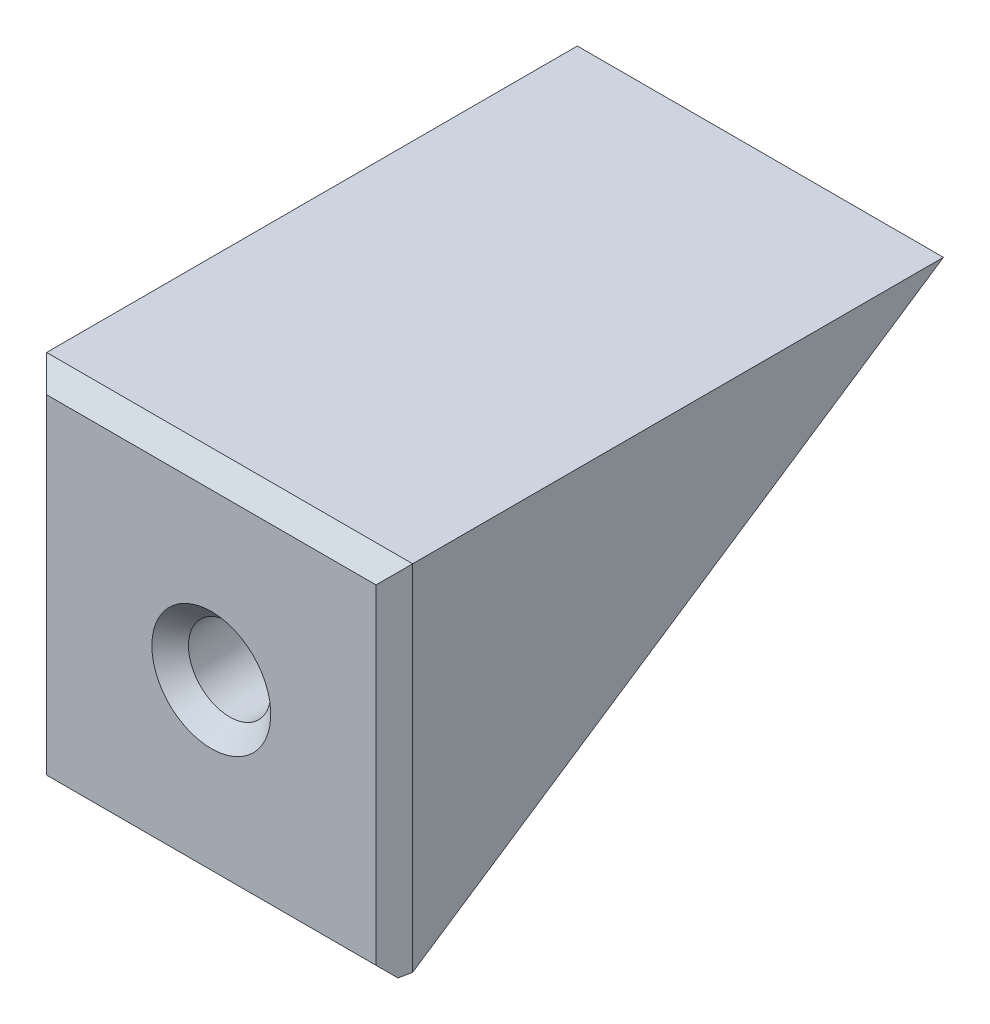
ISO-10303-21;
HEADER;
FILE_DESCRIPTION(('STEP AP214'),'2;1');
FILE_NAME('part.step','',(''),(''),'','','');
FILE_SCHEMA(('AUTOMOTIVE_DESIGN { 1 0 10303 214 1 1 1 1 }'));
ENDSEC;
DATA;
#1=APPLICATION_CONTEXT('core data for automotive mechanical design processes');
#2=APPLICATION_PROTOCOL_DEFINITION('international standard','automotive_design',2000,#1);
#3=PRODUCT_CONTEXT('',#1,'mechanical');
#4=PRODUCT('Part','Part','',(#3));
#5=PRODUCT_RELATED_PRODUCT_CATEGORY('part','',(#4));
#6=PRODUCT_DEFINITION_FORMATION('','',#4);
#7=PRODUCT_DEFINITION_CONTEXT('part definition',#1,'design');
#8=PRODUCT_DEFINITION('design','',#6,#7);
#9=PRODUCT_DEFINITION_SHAPE('','',#8);
#10=(LENGTH_UNIT() NAMED_UNIT(*) SI_UNIT(.MILLI.,.METRE.));
#11=(NAMED_UNIT(*) PLANE_ANGLE_UNIT() SI_UNIT($,.RADIAN.));
#12=(NAMED_UNIT(*) SI_UNIT($,.STERADIAN.) SOLID_ANGLE_UNIT());
#13=UNCERTAINTY_MEASURE_WITH_UNIT(LENGTH_MEASURE(1.E-05),#10,'distance_accuracy_value','');
#14=(GEOMETRIC_REPRESENTATION_CONTEXT(3) GLOBAL_UNCERTAINTY_ASSIGNED_CONTEXT((#13)) GLOBAL_UNIT_ASSIGNED_CONTEXT((#10,
#11,#12)) REPRESENTATION_CONTEXT('',''));
#15=CARTESIAN_POINT('',(0.,0.,0.));
#16=DIRECTION('',(0.,0.,1.));
#17=DIRECTION('',(1.,0.,0.));
#18=AXIS2_PLACEMENT_3D('',#15,#16,#17);
#19=CARTESIAN_POINT('',(0.,-10.,-17.));
#20=DIRECTION('',(0.,0.,1.));
#21=DIRECTION('',(1.,0.,0.));
#22=AXIS2_PLACEMENT_3D('',#19,#20,#21);
#23=PLANE('',#22);
#24=CARTESIAN_POINT('',(0.,-10.,-17.));
#25=DIRECTION('',(0.,0.,1.));
#26=DIRECTION('',(1.,0.,0.));
#27=AXIS2_PLACEMENT_3D('',#24,#25,#26);
#28=CIRCLE('',#27,5.5);
#29=CARTESIAN_POINT('',(-5.33593686452737,-8.66666666666667,-17.));
#30=VERTEX_POINT('',#29);
#31=CARTESIAN_POINT('',(5.33593686452737,-8.66666666666667,-17.));
#32=VERTEX_POINT('',#31);
#33=EDGE_CURVE('E116',#30,#32,#28,.T.);
#34=ORIENTED_EDGE('',*,*,#33,.F.);
#35=CARTESIAN_POINT('',(0.,-10.,-17.));
#36=DIRECTION('',(0.,0.,-1.));
#37=DIRECTION('',(-1.,0.,0.));
#38=AXIS2_PLACEMENT_3D('',#35,#36,#37);
#39=CIRCLE('',#38,5.5);
#40=EDGE_CURVE('E102',#30,#32,#39,.T.);
#41=ORIENTED_EDGE('',*,*,#40,.T.);
#42=EDGE_LOOP('',(#34,#41));
#43=FACE_BOUND('',#42,.T.);
#44=CARTESIAN_POINT('',(0.,-10.,-17.));
#45=DIRECTION('',(0.,0.,-1.));
#46=DIRECTION('',(-1.,0.,0.));
#47=AXIS2_PLACEMENT_3D('',#44,#45,#46);
#48=CIRCLE('',#47,4.2164);
#49=CARTESIAN_POINT('',(-4.2164,-10.,-17.));
#50=VERTEX_POINT('',#49);
#51=EDGE_CURVE('E167',#50,#50,#48,.T.);
#52=ORIENTED_EDGE('',*,*,#51,.F.);
#53=EDGE_LOOP('',(#52));
#54=FACE_BOUND('',#53,.T.);
#55=ADVANCED_FACE('F39',(#43,#54),#23,.F.);
#56=CARTESIAN_POINT('',(10.,0.,-30.));
#57=DIRECTION('',(0.,0.832050294337844,0.554700196225229));
#58=DIRECTION('',(0.,-0.554700196225229,0.832050294337844));
#59=AXIS2_PLACEMENT_3D('',#56,#57,#58);
#60=PLANE('',#59);
#61=DIRECTION('',(0.,0.554700196225229,-0.832050294337844));
#62=VECTOR('',#61,1.);
#63=CARTESIAN_POINT('',(10.,0.,-30.));
#64=LINE('',#63,#62);
#65=CARTESIAN_POINT('',(10.,-19.3333333333333,-0.999999999999997));
#66=VERTEX_POINT('',#65);
#67=CARTESIAN_POINT('',(10.,0.,-30.));
#68=VERTEX_POINT('',#67);
#69=EDGE_CURVE('E129',#66,#68,#64,.T.);
#70=ORIENTED_EDGE('',*,*,#69,.F.);
#71=DIRECTION('',(0.63960214906683,0.426401432711222,-0.639602149066832));
#72=VECTOR('',#71,1.);
#73=CARTESIAN_POINT('',(15.2727272727273,-15.8181818181818,-6.27272727272729));
#74=LINE('',#73,#72);
#75=CARTESIAN_POINT('',(9.6,-19.6,-0.6));
#76=VERTEX_POINT('',#75);
#77=EDGE_CURVE('E140',#66,#76,#74,.F.);
#78=ORIENTED_EDGE('',*,*,#77,.T.);
#79=DIRECTION('',(-1.,0.,0.));
#80=VECTOR('',#79,1.);
#81=CARTESIAN_POINT('',(10.,-19.6,-0.6));
#82=LINE('',#81,#80);
#83=CARTESIAN_POINT('',(-9.6,-19.6,-0.6));
#84=VERTEX_POINT('',#83);
#85=EDGE_CURVE('E137',#76,#84,#82,.T.);
#86=ORIENTED_EDGE('',*,*,#85,.T.);
#87=DIRECTION('',(-0.63960214906683,0.426401432711222,-0.639602149066832));
#88=VECTOR('',#87,1.);
#89=CARTESIAN_POINT('',(-9.,-20.,0.));
#90=LINE('',#89,#88);
#91=CARTESIAN_POINT('',(-10.,-19.3333333333333,-0.999999999999997));
#92=VERTEX_POINT('',#91);
#93=EDGE_CURVE('E120',#84,#92,#90,.T.);
#94=ORIENTED_EDGE('',*,*,#93,.T.);
#95=DIRECTION('',(0.,0.554700196225229,-0.832050294337844));
#96=VECTOR('',#95,1.);
#97=CARTESIAN_POINT('',(-10.,0.,-30.));
#98=LINE('',#97,#96);
#99=CARTESIAN_POINT('',(-10.,0.,-30.));
#100=VERTEX_POINT('',#99);
#101=EDGE_CURVE('E124',#92,#100,#98,.T.);
#102=ORIENTED_EDGE('',*,*,#101,.T.);
#103=DIRECTION('',(-1.,0.,0.));
#104=VECTOR('',#103,1.);
#105=CARTESIAN_POINT('',(10.,0.,-30.));
#106=LINE('',#105,#104);
#107=EDGE_CURVE('E121',#68,#100,#106,.T.);
#108=ORIENTED_EDGE('',*,*,#107,.F.);
#109=EDGE_LOOP('',(#70,#78,#86,#94,#102,#108));
#110=FACE_BOUND('',#109,.T.);
#111=CARTESIAN_POINT('',(0.,-10.,-15.));
#112=DIRECTION('',(0.,0.832050294337844,0.554700196225229));
#113=DIRECTION('',(0.,-0.554700196225229,0.832050294337844));
#114=AXIS2_PLACEMENT_3D('',#111,#112,#113);
#115=ELLIPSE('',#114,9.91526600752597,5.5);
#116=EDGE_CURVE('E105',#30,#32,#115,.F.);
#117=ORIENTED_EDGE('',*,*,#116,.F.);
#118=CARTESIAN_POINT('',(0.,-10.,-15.));
#119=DIRECTION('',(0.,0.832050294337844,0.554700196225229));
#120=DIRECTION('',(0.,0.554700196225229,-0.832050294337844));
#121=AXIS2_PLACEMENT_3D('',#118,#119,#120);
#122=ELLIPSE('',#121,9.91526600752597,5.5);
#123=EDGE_CURVE('E114',#32,#30,#122,.F.);
#124=ORIENTED_EDGE('',*,*,#123,.F.);
#125=EDGE_LOOP('',(#117,#124));
#126=FACE_BOUND('',#125,.T.);
#127=ADVANCED_FACE('F113',(#110,#126),#60,.F.);
#128=CARTESIAN_POINT('',(10.,-20.,0.));
#129=DIRECTION('',(0.,0.,-1.));
#130=DIRECTION('',(-1.,0.,0.));
#131=AXIS2_PLACEMENT_3D('',#128,#129,#130);
#132=PLANE('',#131);
#133=DIRECTION('',(0.,-1.,0.));
#134=VECTOR('',#133,1.);
#135=CARTESIAN_POINT('',(-9.,-20.,0.));
#136=LINE('',#135,#134);
#137=CARTESIAN_POINT('',(-9.,-1.,0.));
#138=VERTEX_POINT('',#137);
#139=CARTESIAN_POINT('',(-9.,-19.,0.));
#140=VERTEX_POINT('',#139);
#141=EDGE_CURVE('E145',#138,#140,#136,.T.);
#142=ORIENTED_EDGE('',*,*,#141,.T.);
#143=DIRECTION('',(1.,0.,0.));
#144=VECTOR('',#143,1.);
#145=CARTESIAN_POINT('',(10.,-19.,0.));
#146=LINE('',#145,#144);
#147=CARTESIAN_POINT('',(9.,-19.,0.));
#148=VERTEX_POINT('',#147);
#149=EDGE_CURVE('E151',#140,#148,#146,.T.);
#150=ORIENTED_EDGE('',*,*,#149,.T.);
#151=DIRECTION('',(0.,1.,0.));
#152=VECTOR('',#151,1.);
#153=CARTESIAN_POINT('',(9.,-20.,0.));
#154=LINE('',#153,#152);
#155=CARTESIAN_POINT('',(9.,-1.,0.));
#156=VERTEX_POINT('',#155);
#157=EDGE_CURVE('E149',#148,#156,#154,.T.);
#158=ORIENTED_EDGE('',*,*,#157,.T.);
#159=DIRECTION('',(-1.,0.,0.));
#160=VECTOR('',#159,1.);
#161=CARTESIAN_POINT('',(10.,-1.,0.));
#162=LINE('',#161,#160);
#163=EDGE_CURVE('E147',#156,#138,#162,.T.);
#164=ORIENTED_EDGE('',*,*,#163,.T.);
#165=EDGE_LOOP('',(#142,#150,#158,#164));
#166=FACE_BOUND('',#165,.T.);
#167=CARTESIAN_POINT('',(0.,-10.,0.));
#168=DIRECTION('',(0.,0.,-1.));
#169=DIRECTION('',(-1.,0.,0.));
#170=AXIS2_PLACEMENT_3D('',#167,#168,#169);
#171=CIRCLE('',#170,3.2479);
#172=CARTESIAN_POINT('',(-3.2479,-10.,0.));
#173=VERTEX_POINT('',#172);
#174=EDGE_CURVE('E142',#173,#173,#171,.T.);
#175=ORIENTED_EDGE('',*,*,#174,.T.);
#176=EDGE_LOOP('',(#175));
#177=FACE_BOUND('',#176,.T.);
#178=ADVANCED_FACE('F199',(#166,#177),#132,.F.);
#179=CARTESIAN_POINT('',(10.,0.,0.));
#180=DIRECTION('',(0.,-1.,0.));
#181=DIRECTION('',(0.,0.,-1.));
#182=AXIS2_PLACEMENT_3D('',#179,#180,#181);
#183=PLANE('',#182);
#184=DIRECTION('',(0.,0.,1.));
#185=VECTOR('',#184,1.);
#186=CARTESIAN_POINT('',(-10.,0.,0.));
#187=LINE('',#186,#185);
#188=CARTESIAN_POINT('',(-10.,0.,-1.));
#189=VERTEX_POINT('',#188);
#190=EDGE_CURVE('E126',#100,#189,#187,.T.);
#191=ORIENTED_EDGE('',*,*,#190,.T.);
#192=DIRECTION('',(1.,0.,0.));
#193=VECTOR('',#192,1.);
#194=CARTESIAN_POINT('',(10.,0.,-1.));
#195=LINE('',#194,#193);
#196=CARTESIAN_POINT('',(10.,0.,-1.));
#197=VERTEX_POINT('',#196);
#198=EDGE_CURVE('E63',#189,#197,#195,.T.);
#199=ORIENTED_EDGE('',*,*,#198,.T.);
#200=DIRECTION('',(0.,0.,1.));
#201=VECTOR('',#200,1.);
#202=CARTESIAN_POINT('',(10.,0.,0.));
#203=LINE('',#202,#201);
#204=EDGE_CURVE('E131',#68,#197,#203,.T.);
#205=ORIENTED_EDGE('',*,*,#204,.F.);
#206=ORIENTED_EDGE('',*,*,#107,.T.);
#207=EDGE_LOOP('',(#191,#199,#205,#206));
#208=FACE_BOUND('',#207,.T.);
#209=ADVANCED_FACE('F210',(#208),#183,.F.);
#210=CARTESIAN_POINT('',(10.,0.,0.));
#211=DIRECTION('',(-1.,0.,0.));
#212=DIRECTION('',(0.,0.,1.));
#213=AXIS2_PLACEMENT_3D('',#210,#211,#212);
#214=PLANE('',#213);
#215=ORIENTED_EDGE('',*,*,#204,.T.);
#216=DIRECTION('',(0.,-1.,0.));
#217=VECTOR('',#216,1.);
#218=CARTESIAN_POINT('',(10.,0.,-1.));
#219=LINE('',#218,#217);
#220=EDGE_CURVE('E154',#197,#66,#219,.T.);
#221=ORIENTED_EDGE('',*,*,#220,.T.);
#222=ORIENTED_EDGE('',*,*,#69,.T.);
#223=EDGE_LOOP('',(#215,#221,#222));
#224=FACE_BOUND('',#223,.T.);
#225=ADVANCED_FACE('F207',(#224),#214,.F.);
#226=CARTESIAN_POINT('',(-10.,0.,0.));
#227=DIRECTION('',(-1.,0.,0.));
#228=DIRECTION('',(0.,0.,1.));
#229=AXIS2_PLACEMENT_3D('',#226,#227,#228);
#230=PLANE('',#229);
#231=ORIENTED_EDGE('',*,*,#101,.F.);
#232=DIRECTION('',(0.,1.,0.));
#233=VECTOR('',#232,1.);
#234=CARTESIAN_POINT('',(-10.,0.,-1.));
#235=LINE('',#234,#233);
#236=EDGE_CURVE('E49',#92,#189,#235,.T.);
#237=ORIENTED_EDGE('',*,*,#236,.T.);
#238=ORIENTED_EDGE('',*,*,#190,.F.);
#239=EDGE_LOOP('',(#231,#237,#238));
#240=FACE_BOUND('',#239,.T.);
#241=ADVANCED_FACE('F206',(#240),#230,.T.);
#242=CARTESIAN_POINT('',(0.,-10.,0.));
#243=DIRECTION('',(0.,0.,-1.));
#244=DIRECTION('',(-1.,0.,0.));
#245=AXIS2_PLACEMENT_3D('',#242,#243,#244);
#246=CYLINDRICAL_SURFACE('',#245,5.5);
#247=ORIENTED_EDGE('',*,*,#33,.T.);
#248=ORIENTED_EDGE('',*,*,#123,.T.);
#249=EDGE_LOOP('',(#247,#248));
#250=FACE_BOUND('',#249,.T.);
#251=ADVANCED_FACE('F119',(#250),#246,.T.);
#252=CARTESIAN_POINT('',(0.,-10.,-37.));
#253=DIRECTION('',(0.,0.,1.));
#254=DIRECTION('',(1.,0.,0.));
#255=AXIS2_PLACEMENT_3D('',#252,#253,#254);
#256=CYLINDRICAL_SURFACE('',#255,5.5);
#257=ORIENTED_EDGE('',*,*,#116,.T.);
#258=ORIENTED_EDGE('',*,*,#40,.F.);
#259=EDGE_LOOP('',(#257,#258));
#260=FACE_BOUND('',#259,.T.);
#261=ADVANCED_FACE('F104',(#260),#256,.F.);
#262=CARTESIAN_POINT('',(0.,-10.,-17.));
#263=DIRECTION('',(0.,0.,-1.));
#264=DIRECTION('',(-1.,0.,0.));
#265=AXIS2_PLACEMENT_3D('',#262,#263,#264);
#266=CYLINDRICAL_SURFACE('',#265,2.2479);
#267=CARTESIAN_POINT('',(0.,-10.,-1.00000000000001));
#268=DIRECTION('',(0.,0.,-1.));
#269=DIRECTION('',(-1.,0.,0.));
#270=AXIS2_PLACEMENT_3D('',#267,#268,#269);
#271=CIRCLE('',#270,2.2479);
#272=CARTESIAN_POINT('',(-2.2479,-10.,-1.00000000000001));
#273=VERTEX_POINT('',#272);
#274=EDGE_CURVE('E11',#273,#273,#271,.F.);
#275=ORIENTED_EDGE('',*,*,#274,.T.);
#276=EDGE_LOOP('',(#275));
#277=FACE_BOUND('',#276,.T.);
#278=CARTESIAN_POINT('',(0.,-10.,-14.7354997903854));
#279=DIRECTION('',(0.,0.,-1.));
#280=DIRECTION('',(-1.,0.,0.));
#281=AXIS2_PLACEMENT_3D('',#278,#279,#280);
#282=CIRCLE('',#281,2.2479);
#283=CARTESIAN_POINT('',(-2.2479,-10.,-14.7354997903854));
#284=VERTEX_POINT('',#283);
#285=EDGE_CURVE('E109',#284,#284,#282,.T.);
#286=ORIENTED_EDGE('',*,*,#285,.T.);
#287=EDGE_LOOP('',(#286));
#288=FACE_BOUND('',#287,.T.);
#289=ADVANCED_FACE('F180',(#277,#288),#266,.F.);
#290=CARTESIAN_POINT('',(0.,-10.,-17.));
#291=DIRECTION('',(0.,0.,-1.));
#292=DIRECTION('',(-1.,0.,0.));
#293=AXIS2_PLACEMENT_3D('',#290,#291,#292);
#294=CONICAL_SURFACE('',#293,4.2164,0.715584993317675);
#295=ORIENTED_EDGE('',*,*,#285,.F.);
#296=EDGE_LOOP('',(#295));
#297=FACE_BOUND('',#296,.T.);
#298=ORIENTED_EDGE('',*,*,#51,.T.);
#299=EDGE_LOOP('',(#298));
#300=FACE_BOUND('',#299,.T.);
#301=ADVANCED_FACE('F182',(#297,#300),#294,.F.);
#302=CARTESIAN_POINT('',(10.,-1.,0.));
#303=DIRECTION('',(0.,-0.707106781186549,-0.707106781186546));
#304=DIRECTION('',(-1.,0.,0.));
#305=AXIS2_PLACEMENT_3D('',#302,#303,#304);
#306=PLANE('',#305);
#307=DIRECTION('',(0.577350269189625,-0.577350269189625,0.577350269189627));
#308=VECTOR('',#307,1.);
#309=CARTESIAN_POINT('',(-2.66666666666668,-7.33333333333332,6.33333333333334));
#310=LINE('',#309,#308);
#311=EDGE_CURVE('E161',#138,#189,#310,.F.);
#312=ORIENTED_EDGE('',*,*,#311,.F.);
#313=ORIENTED_EDGE('',*,*,#163,.F.);
#314=DIRECTION('',(0.577350269189625,0.577350269189625,-0.577350269189627));
#315=VECTOR('',#314,1.);
#316=CARTESIAN_POINT('',(9.33333333333333,-0.666666666666668,-0.333333333333334));
#317=LINE('',#316,#315);
#318=EDGE_CURVE('E44',#197,#156,#317,.F.);
#319=ORIENTED_EDGE('',*,*,#318,.F.);
#320=ORIENTED_EDGE('',*,*,#198,.F.);
#321=EDGE_LOOP('',(#312,#313,#319,#320));
#322=FACE_BOUND('',#321,.T.);
#323=ADVANCED_FACE('F184',(#322),#306,.F.);
#324=CARTESIAN_POINT('',(10.,0.,-1.));
#325=DIRECTION('',(-0.707106781186549,0.,-0.707106781186546));
#326=DIRECTION('',(0.,-1.,0.));
#327=AXIS2_PLACEMENT_3D('',#324,#325,#326);
#328=PLANE('',#327);
#329=ORIENTED_EDGE('',*,*,#318,.T.);
#330=ORIENTED_EDGE('',*,*,#157,.F.);
#331=DIRECTION('',(0.577350269189624,-0.577350269189626,-0.577350269189626));
#332=VECTOR('',#331,1.);
#333=CARTESIAN_POINT('',(3.33333333333334,-13.3333333333333,5.66666666666668));
#334=LINE('',#333,#332);
#335=EDGE_CURVE('E160',#76,#148,#334,.F.);
#336=ORIENTED_EDGE('',*,*,#335,.F.);
#337=ORIENTED_EDGE('',*,*,#77,.F.);
#338=ORIENTED_EDGE('',*,*,#220,.F.);
#339=EDGE_LOOP('',(#329,#330,#336,#337,#338));
#340=FACE_BOUND('',#339,.T.);
#341=ADVANCED_FACE('F190',(#340),#328,.F.);
#342=CARTESIAN_POINT('',(-9.,-20.,0.));
#343=DIRECTION('',(-0.707106781186549,0.,0.707106781186546));
#344=DIRECTION('',(0.,1.,0.));
#345=AXIS2_PLACEMENT_3D('',#342,#343,#344);
#346=PLANE('',#345);
#347=ORIENTED_EDGE('',*,*,#236,.F.);
#348=ORIENTED_EDGE('',*,*,#93,.F.);
#349=DIRECTION('',(-0.577350269189624,-0.577350269189626,-0.577350269189626));
#350=VECTOR('',#349,1.);
#351=CARTESIAN_POINT('',(-9.33333333333333,-19.3333333333333,-0.333333333333334));
#352=LINE('',#351,#350);
#353=EDGE_CURVE('E158',#140,#84,#352,.T.);
#354=ORIENTED_EDGE('',*,*,#353,.F.);
#355=ORIENTED_EDGE('',*,*,#141,.F.);
#356=ORIENTED_EDGE('',*,*,#311,.T.);
#357=EDGE_LOOP('',(#347,#348,#354,#355,#356));
#358=FACE_BOUND('',#357,.T.);
#359=ADVANCED_FACE('F226',(#358),#346,.T.);
#360=CARTESIAN_POINT('',(10.,-19.6,-0.600000000000003));
#361=DIRECTION('',(0.,0.707106781186547,-0.707106781186547));
#362=DIRECTION('',(-1.,0.,0.));
#363=AXIS2_PLACEMENT_3D('',#360,#361,#362);
#364=PLANE('',#363);
#365=ORIENTED_EDGE('',*,*,#335,.T.);
#366=ORIENTED_EDGE('',*,*,#149,.F.);
#367=ORIENTED_EDGE('',*,*,#353,.T.);
#368=ORIENTED_EDGE('',*,*,#85,.F.);
#369=EDGE_LOOP('',(#365,#366,#367,#368));
#370=FACE_BOUND('',#369,.T.);
#371=ADVANCED_FACE('F220',(#370),#364,.F.);
#372=CARTESIAN_POINT('',(0.,-10.,0.));
#373=DIRECTION('',(0.,0.,1.));
#374=DIRECTION('',(1.,0.,0.));
#375=AXIS2_PLACEMENT_3D('',#372,#373,#374);
#376=CONICAL_SURFACE('',#375,3.2479,0.785398163397445);
#377=ORIENTED_EDGE('',*,*,#274,.F.);
#378=EDGE_LOOP('',(#377));
#379=FACE_BOUND('',#378,.T.);
#380=ORIENTED_EDGE('',*,*,#174,.F.);
#381=EDGE_LOOP('',(#380));
#382=FACE_BOUND('',#381,.T.);
#383=ADVANCED_FACE('F42',(#379,#382),#376,.F.);
#384=CLOSED_SHELL('',(#55,#127,#178,#209,#225,#241,#251,#261,#289,#301,#323,#341,#359,#371,#383));
#385=MANIFOLD_SOLID_BREP('B2',#384);
#386=ADVANCED_BREP_SHAPE_REPRESENTATION('',(#18,#385),#14);
#387=SHAPE_DEFINITION_REPRESENTATION(#9,#386);
ENDSEC;
END-ISO-10303-21;
